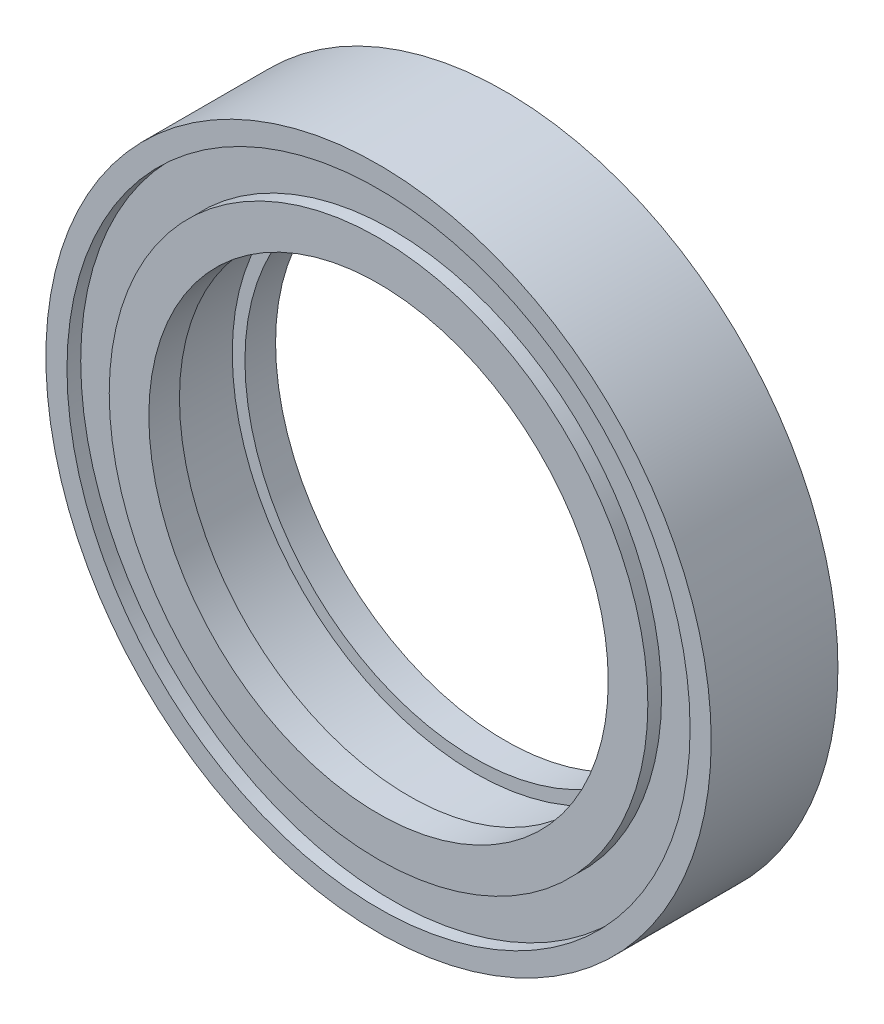
ISO-10303-21;
HEADER;
FILE_DESCRIPTION(('STEP AP214'),'2;1');
FILE_NAME('part.step','',(''),(''),'','','');
FILE_SCHEMA(('AUTOMOTIVE_DESIGN { 1 0 10303 214 1 1 1 1 }'));
ENDSEC;
DATA;
#1=APPLICATION_CONTEXT('core data for automotive mechanical design processes');
#2=APPLICATION_PROTOCOL_DEFINITION('international standard','automotive_design',2000,#1);
#3=PRODUCT_CONTEXT('',#1,'mechanical');
#4=PRODUCT('Part','Part','',(#3));
#5=PRODUCT_RELATED_PRODUCT_CATEGORY('part','',(#4));
#6=PRODUCT_DEFINITION_FORMATION('','',#4);
#7=PRODUCT_DEFINITION_CONTEXT('part definition',#1,'design');
#8=PRODUCT_DEFINITION('design','',#6,#7);
#9=PRODUCT_DEFINITION_SHAPE('','',#8);
#10=(LENGTH_UNIT() NAMED_UNIT(*) SI_UNIT(.MILLI.,.METRE.));
#11=(NAMED_UNIT(*) PLANE_ANGLE_UNIT() SI_UNIT($,.RADIAN.));
#12=(NAMED_UNIT(*) SI_UNIT($,.STERADIAN.) SOLID_ANGLE_UNIT());
#13=UNCERTAINTY_MEASURE_WITH_UNIT(LENGTH_MEASURE(1.E-05),#10,'distance_accuracy_value','');
#14=(GEOMETRIC_REPRESENTATION_CONTEXT(3) GLOBAL_UNCERTAINTY_ASSIGNED_CONTEXT((#13)) GLOBAL_UNIT_ASSIGNED_CONTEXT((#10,
#11,#12)) REPRESENTATION_CONTEXT('',''));
#15=CARTESIAN_POINT('',(0.,0.,0.));
#16=DIRECTION('',(0.,0.,1.));
#17=DIRECTION('',(1.,0.,0.));
#18=AXIS2_PLACEMENT_3D('',#15,#16,#17);
#19=CARTESIAN_POINT('',(3.43024899888577E-12,0.,1000.));
#20=DIRECTION('',(0.,0.,1.));
#21=DIRECTION('',(1.,0.,0.));
#22=AXIS2_PLACEMENT_3D('',#19,#20,#21);
#23=CYLINDRICAL_SURFACE('',#22,315.);
#24=CARTESIAN_POINT('',(2.05814939933142E-13,0.,59.9999999999989));
#25=DIRECTION('',(0.,0.,1.));
#26=DIRECTION('',(1.,0.,0.));
#27=AXIS2_PLACEMENT_3D('',#24,#25,#26);
#28=CIRCLE('',#27,315.);
#29=CARTESIAN_POINT('',(315.,0.,59.9999999999979));
#30=VERTEX_POINT('',#29);
#31=EDGE_CURVE('E104',#30,#30,#28,.T.);
#32=ORIENTED_EDGE('',*,*,#31,.F.);
#33=EDGE_LOOP('',(#32));
#34=FACE_BOUND('',#33,.T.);
#35=CARTESIAN_POINT('',(-2.0581493993315E-13,0.,-60.0000000000012));
#36=DIRECTION('',(0.,0.,1.));
#37=DIRECTION('',(1.,0.,0.));
#38=AXIS2_PLACEMENT_3D('',#35,#36,#37);
#39=CIRCLE('',#38,314.999999999999);
#40=CARTESIAN_POINT('',(314.999999999999,0.,-60.0000000000022));
#41=VERTEX_POINT('',#40);
#42=EDGE_CURVE('E10',#41,#41,#39,.T.);
#43=ORIENTED_EDGE('',*,*,#42,.T.);
#44=EDGE_LOOP('',(#43));
#45=FACE_BOUND('',#44,.T.);
#46=ADVANCED_FACE('F37',(#34,#45),#23,.T.);
#47=CARTESIAN_POINT('',(-315.,0.,-60.));
#48=DIRECTION('',(0.,0.,1.));
#49=DIRECTION('',(1.,0.,0.));
#50=AXIS2_PLACEMENT_3D('',#47,#48,#49);
#51=PLANE('',#50);
#52=ORIENTED_EDGE('',*,*,#42,.F.);
#53=EDGE_LOOP('',(#52));
#54=FACE_BOUND('',#53,.T.);
#55=CARTESIAN_POINT('',(-2.0581493993315E-13,0.,-60.0000000000012));
#56=DIRECTION('',(0.,0.,1.));
#57=DIRECTION('',(1.,0.,0.));
#58=AXIS2_PLACEMENT_3D('',#55,#56,#57);
#59=CIRCLE('',#58,294.999999999999);
#60=CARTESIAN_POINT('',(294.999999999999,0.,-60.0000000000022));
#61=VERTEX_POINT('',#60);
#62=EDGE_CURVE('E44',#61,#61,#59,.T.);
#63=ORIENTED_EDGE('',*,*,#62,.T.);
#64=EDGE_LOOP('',(#63));
#65=FACE_BOUND('',#64,.T.);
#66=ADVANCED_FACE('F112',(#54,#65),#51,.F.);
#67=CARTESIAN_POINT('',(3.43024899888577E-12,0.,1000.));
#68=DIRECTION('',(0.,0.,1.));
#69=DIRECTION('',(1.,0.,0.));
#70=AXIS2_PLACEMENT_3D('',#67,#68,#69);
#71=CYLINDRICAL_SURFACE('',#70,294.999999999999);
#72=ORIENTED_EDGE('',*,*,#62,.F.);
#73=EDGE_LOOP('',(#72));
#74=FACE_BOUND('',#73,.T.);
#75=CARTESIAN_POINT('',(-1.61221702947636E-13,0.,-47.0000000000015));
#76=DIRECTION('',(0.,0.,1.));
#77=DIRECTION('',(1.,0.,0.));
#78=AXIS2_PLACEMENT_3D('',#75,#76,#77);
#79=CIRCLE('',#78,294.999999999999);
#80=CARTESIAN_POINT('',(294.999999999999,0.,-47.0000000000025));
#81=VERTEX_POINT('',#80);
#82=EDGE_CURVE('E49',#81,#81,#79,.T.);
#83=ORIENTED_EDGE('',*,*,#82,.T.);
#84=EDGE_LOOP('',(#83));
#85=FACE_BOUND('',#84,.T.);
#86=ADVANCED_FACE('F116',(#74,#85),#71,.F.);
#87=CARTESIAN_POINT('',(-295.,0.,-47.0000000000002));
#88=DIRECTION('',(0.,0.,1.));
#89=DIRECTION('',(1.,0.,0.));
#90=AXIS2_PLACEMENT_3D('',#87,#88,#89);
#91=PLANE('',#90);
#92=ORIENTED_EDGE('',*,*,#82,.F.);
#93=EDGE_LOOP('',(#92));
#94=FACE_BOUND('',#93,.T.);
#95=CARTESIAN_POINT('',(-1.61221702947635E-13,0.,-47.0000000000013));
#96=DIRECTION('',(0.,0.,1.));
#97=DIRECTION('',(1.,0.,0.));
#98=AXIS2_PLACEMENT_3D('',#95,#96,#97);
#99=CIRCLE('',#98,255.);
#100=CARTESIAN_POINT('',(254.999999999999,0.,-47.0000000000021));
#101=VERTEX_POINT('',#100);
#102=EDGE_CURVE('E54',#101,#101,#99,.T.);
#103=ORIENTED_EDGE('',*,*,#102,.T.);
#104=EDGE_LOOP('',(#103));
#105=FACE_BOUND('',#104,.T.);
#106=ADVANCED_FACE('F121',(#94,#105),#91,.F.);
#107=CARTESIAN_POINT('',(3.43024899888577E-12,0.,1000.));
#108=DIRECTION('',(0.,0.,1.));
#109=DIRECTION('',(1.,0.,0.));
#110=AXIS2_PLACEMENT_3D('',#107,#108,#109);
#111=CYLINDRICAL_SURFACE('',#110,255.);
#112=ORIENTED_EDGE('',*,*,#102,.F.);
#113=EDGE_LOOP('',(#112));
#114=FACE_BOUND('',#113,.T.);
#115=CARTESIAN_POINT('',(-2.0581493993315E-13,0.,-60.0000000000009));
#116=DIRECTION('',(0.,0.,1.));
#117=DIRECTION('',(1.,0.,0.));
#118=AXIS2_PLACEMENT_3D('',#115,#116,#117);
#119=CIRCLE('',#118,255.);
#120=CARTESIAN_POINT('',(254.999999999999,0.,-60.0000000000018));
#121=VERTEX_POINT('',#120);
#122=EDGE_CURVE('E60',#121,#121,#119,.T.);
#123=ORIENTED_EDGE('',*,*,#122,.T.);
#124=EDGE_LOOP('',(#123));
#125=FACE_BOUND('',#124,.T.);
#126=ADVANCED_FACE('F127',(#114,#125),#111,.T.);
#127=CARTESIAN_POINT('',(-255.,0.,-59.9999999999999));
#128=DIRECTION('',(0.,0.,1.));
#129=DIRECTION('',(1.,0.,0.));
#130=AXIS2_PLACEMENT_3D('',#127,#128,#129);
#131=PLANE('',#130);
#132=ORIENTED_EDGE('',*,*,#122,.F.);
#133=EDGE_LOOP('',(#132));
#134=FACE_BOUND('',#133,.T.);
#135=CARTESIAN_POINT('',(-2.05814939933149E-13,0.,-60.0000000000007));
#136=DIRECTION('',(0.,0.,1.));
#137=DIRECTION('',(1.,0.,0.));
#138=AXIS2_PLACEMENT_3D('',#135,#136,#137);
#139=CIRCLE('',#138,217.499999999999);
#140=CARTESIAN_POINT('',(217.499999999999,0.,-60.0000000000015));
#141=VERTEX_POINT('',#140);
#142=EDGE_CURVE('E64',#141,#141,#139,.T.);
#143=ORIENTED_EDGE('',*,*,#142,.T.);
#144=EDGE_LOOP('',(#143));
#145=FACE_BOUND('',#144,.T.);
#146=ADVANCED_FACE('F131',(#134,#145),#131,.F.);
#147=CARTESIAN_POINT('',(3.43024899888577E-12,0.,1000.));
#148=DIRECTION('',(0.,0.,1.));
#149=DIRECTION('',(1.,0.,0.));
#150=AXIS2_PLACEMENT_3D('',#147,#148,#149);
#151=CYLINDRICAL_SURFACE('',#150,217.5);
#152=ORIENTED_EDGE('',*,*,#142,.F.);
#153=EDGE_LOOP('',(#152));
#154=FACE_BOUND('',#153,.T.);
#155=CARTESIAN_POINT('',(-1.06337718965461E-13,0.,-31.0000000000006));
#156=DIRECTION('',(0.,0.,1.));
#157=DIRECTION('',(1.,0.,0.));
#158=AXIS2_PLACEMENT_3D('',#155,#156,#157);
#159=CIRCLE('',#158,217.5);
#160=CARTESIAN_POINT('',(217.499999999999,0.,-31.0000000000013));
#161=VERTEX_POINT('',#160);
#162=EDGE_CURVE('E68',#161,#161,#159,.T.);
#163=ORIENTED_EDGE('',*,*,#162,.T.);
#164=EDGE_LOOP('',(#163));
#165=FACE_BOUND('',#164,.T.);
#166=ADVANCED_FACE('F135',(#154,#165),#151,.F.);
#167=CARTESIAN_POINT('',(-217.5,0.,-31.));
#168=DIRECTION('',(0.,0.,-1.));
#169=DIRECTION('',(-1.,0.,0.));
#170=AXIS2_PLACEMENT_3D('',#167,#168,#169);
#171=PLANE('',#170);
#172=ORIENTED_EDGE('',*,*,#162,.F.);
#173=EDGE_LOOP('',(#172));
#174=FACE_BOUND('',#173,.T.);
#175=CARTESIAN_POINT('',(-1.06337718965461E-13,0.,-31.0000000000008));
#176=DIRECTION('',(0.,0.,1.));
#177=DIRECTION('',(1.,0.,0.));
#178=AXIS2_PLACEMENT_3D('',#175,#176,#177);
#179=CIRCLE('',#178,229.5);
#180=CARTESIAN_POINT('',(229.499999999999,0.,-31.0000000000016));
#181=VERTEX_POINT('',#180);
#182=EDGE_CURVE('E72',#181,#181,#179,.T.);
#183=ORIENTED_EDGE('',*,*,#182,.T.);
#184=EDGE_LOOP('',(#183));
#185=FACE_BOUND('',#184,.T.);
#186=ADVANCED_FACE('F139',(#174,#185),#171,.F.);
#187=CARTESIAN_POINT('',(3.43024899888577E-12,0.,1000.));
#188=DIRECTION('',(0.,0.,1.));
#189=DIRECTION('',(1.,0.,0.));
#190=AXIS2_PLACEMENT_3D('',#187,#188,#189);
#191=CYLINDRICAL_SURFACE('',#190,229.5);
#192=ORIENTED_EDGE('',*,*,#182,.F.);
#193=EDGE_LOOP('',(#192));
#194=FACE_BOUND('',#193,.T.);
#195=CARTESIAN_POINT('',(1.06337718965456E-13,0.,30.9999999999993));
#196=DIRECTION('',(0.,0.,1.));
#197=DIRECTION('',(1.,0.,0.));
#198=AXIS2_PLACEMENT_3D('',#195,#196,#197);
#199=CIRCLE('',#198,229.5);
#200=CARTESIAN_POINT('',(229.5,0.,30.9999999999985));
#201=VERTEX_POINT('',#200);
#202=EDGE_CURVE('E76',#201,#201,#199,.T.);
#203=ORIENTED_EDGE('',*,*,#202,.T.);
#204=EDGE_LOOP('',(#203));
#205=FACE_BOUND('',#204,.T.);
#206=ADVANCED_FACE('F143',(#194,#205),#191,.F.);
#207=CARTESIAN_POINT('',(-229.5,0.,31.));
#208=DIRECTION('',(0.,0.,1.));
#209=DIRECTION('',(1.,0.,0.));
#210=AXIS2_PLACEMENT_3D('',#207,#208,#209);
#211=PLANE('',#210);
#212=ORIENTED_EDGE('',*,*,#202,.F.);
#213=EDGE_LOOP('',(#212));
#214=FACE_BOUND('',#213,.T.);
#215=CARTESIAN_POINT('',(1.06337718965456E-13,0.,30.9999999999993));
#216=DIRECTION('',(0.,0.,1.));
#217=DIRECTION('',(1.,0.,0.));
#218=AXIS2_PLACEMENT_3D('',#215,#216,#217);
#219=CIRCLE('',#218,217.5);
#220=CARTESIAN_POINT('',(217.5,0.,30.9999999999985));
#221=VERTEX_POINT('',#220);
#222=EDGE_CURVE('E80',#221,#221,#219,.T.);
#223=ORIENTED_EDGE('',*,*,#222,.T.);
#224=EDGE_LOOP('',(#223));
#225=FACE_BOUND('',#224,.T.);
#226=ADVANCED_FACE('F147',(#214,#225),#211,.F.);
#227=CARTESIAN_POINT('',(3.43024899888577E-12,0.,1000.));
#228=DIRECTION('',(0.,0.,1.));
#229=DIRECTION('',(1.,0.,0.));
#230=AXIS2_PLACEMENT_3D('',#227,#228,#229);
#231=CYLINDRICAL_SURFACE('',#230,217.5);
#232=ORIENTED_EDGE('',*,*,#222,.F.);
#233=EDGE_LOOP('',(#232));
#234=FACE_BOUND('',#233,.T.);
#235=CARTESIAN_POINT('',(2.05814939933143E-13,0.,59.9999999999992));
#236=DIRECTION('',(0.,0.,1.));
#237=DIRECTION('',(1.,0.,0.));
#238=AXIS2_PLACEMENT_3D('',#235,#236,#237);
#239=CIRCLE('',#238,217.5);
#240=CARTESIAN_POINT('',(217.5,0.,59.9999999999984));
#241=VERTEX_POINT('',#240);
#242=EDGE_CURVE('E84',#241,#241,#239,.T.);
#243=ORIENTED_EDGE('',*,*,#242,.T.);
#244=EDGE_LOOP('',(#243));
#245=FACE_BOUND('',#244,.T.);
#246=ADVANCED_FACE('F151',(#234,#245),#231,.F.);
#247=CARTESIAN_POINT('',(-217.5,0.,59.9999999999999));
#248=DIRECTION('',(0.,0.,-1.));
#249=DIRECTION('',(-1.,0.,0.));
#250=AXIS2_PLACEMENT_3D('',#247,#248,#249);
#251=PLANE('',#250);
#252=ORIENTED_EDGE('',*,*,#242,.F.);
#253=EDGE_LOOP('',(#252));
#254=FACE_BOUND('',#253,.T.);
#255=CARTESIAN_POINT('',(2.05814939933143E-13,0.,59.9999999999992));
#256=DIRECTION('',(0.,0.,1.));
#257=DIRECTION('',(1.,0.,0.));
#258=AXIS2_PLACEMENT_3D('',#255,#256,#257);
#259=CIRCLE('',#258,255.);
#260=CARTESIAN_POINT('',(255.,0.,59.9999999999983));
#261=VERTEX_POINT('',#260);
#262=EDGE_CURVE('E88',#261,#261,#259,.T.);
#263=ORIENTED_EDGE('',*,*,#262,.T.);
#264=EDGE_LOOP('',(#263));
#265=FACE_BOUND('',#264,.T.);
#266=ADVANCED_FACE('F155',(#254,#265),#251,.F.);
#267=CARTESIAN_POINT('',(3.43024899888577E-12,0.,1000.));
#268=DIRECTION('',(0.,0.,1.));
#269=DIRECTION('',(1.,0.,0.));
#270=AXIS2_PLACEMENT_3D('',#267,#268,#269);
#271=CYLINDRICAL_SURFACE('',#270,255.);
#272=ORIENTED_EDGE('',*,*,#262,.F.);
#273=EDGE_LOOP('',(#272));
#274=FACE_BOUND('',#273,.T.);
#275=CARTESIAN_POINT('',(1.61221702947628E-13,0.,46.9999999999992));
#276=DIRECTION('',(0.,0.,1.));
#277=DIRECTION('',(1.,0.,0.));
#278=AXIS2_PLACEMENT_3D('',#275,#276,#277);
#279=CIRCLE('',#278,255.);
#280=CARTESIAN_POINT('',(255.,0.,46.9999999999983));
#281=VERTEX_POINT('',#280);
#282=EDGE_CURVE('E92',#281,#281,#279,.T.);
#283=ORIENTED_EDGE('',*,*,#282,.T.);
#284=EDGE_LOOP('',(#283));
#285=FACE_BOUND('',#284,.T.);
#286=ADVANCED_FACE('F159',(#274,#285),#271,.T.);
#287=CARTESIAN_POINT('',(-255.,0.,46.9999999999999));
#288=DIRECTION('',(0.,0.,-1.));
#289=DIRECTION('',(-1.,0.,0.));
#290=AXIS2_PLACEMENT_3D('',#287,#288,#289);
#291=PLANE('',#290);
#292=ORIENTED_EDGE('',*,*,#282,.F.);
#293=EDGE_LOOP('',(#292));
#294=FACE_BOUND('',#293,.T.);
#295=CARTESIAN_POINT('',(1.61221702947628E-13,0.,46.999999999999));
#296=DIRECTION('',(0.,0.,1.));
#297=DIRECTION('',(1.,0.,0.));
#298=AXIS2_PLACEMENT_3D('',#295,#296,#297);
#299=CIRCLE('',#298,295.);
#300=CARTESIAN_POINT('',(295.,0.,46.999999999998));
#301=VERTEX_POINT('',#300);
#302=EDGE_CURVE('E96',#301,#301,#299,.T.);
#303=ORIENTED_EDGE('',*,*,#302,.T.);
#304=EDGE_LOOP('',(#303));
#305=FACE_BOUND('',#304,.T.);
#306=ADVANCED_FACE('F163',(#294,#305),#291,.F.);
#307=CARTESIAN_POINT('',(3.43024899888577E-12,0.,1000.));
#308=DIRECTION('',(0.,0.,1.));
#309=DIRECTION('',(1.,0.,0.));
#310=AXIS2_PLACEMENT_3D('',#307,#308,#309);
#311=CYLINDRICAL_SURFACE('',#310,295.);
#312=ORIENTED_EDGE('',*,*,#302,.F.);
#313=EDGE_LOOP('',(#312));
#314=FACE_BOUND('',#313,.T.);
#315=CARTESIAN_POINT('',(2.05814939933143E-13,0.,59.9999999999991));
#316=DIRECTION('',(0.,0.,1.));
#317=DIRECTION('',(1.,0.,0.));
#318=AXIS2_PLACEMENT_3D('',#315,#316,#317);
#319=CIRCLE('',#318,295.);
#320=CARTESIAN_POINT('',(295.,0.,59.999999999998));
#321=VERTEX_POINT('',#320);
#322=EDGE_CURVE('E100',#321,#321,#319,.T.);
#323=ORIENTED_EDGE('',*,*,#322,.T.);
#324=EDGE_LOOP('',(#323));
#325=FACE_BOUND('',#324,.T.);
#326=ADVANCED_FACE('F167',(#314,#325),#311,.F.);
#327=CARTESIAN_POINT('',(-294.999999999999,0.,60.));
#328=DIRECTION('',(0.,0.,-1.));
#329=DIRECTION('',(-1.,0.,0.));
#330=AXIS2_PLACEMENT_3D('',#327,#328,#329);
#331=PLANE('',#330);
#332=ORIENTED_EDGE('',*,*,#322,.F.);
#333=EDGE_LOOP('',(#332));
#334=FACE_BOUND('',#333,.T.);
#335=ORIENTED_EDGE('',*,*,#31,.T.);
#336=EDGE_LOOP('',(#335));
#337=FACE_BOUND('',#336,.T.);
#338=ADVANCED_FACE('F109',(#334,#337),#331,.F.);
#339=CLOSED_SHELL('',(#46,#66,#86,#106,#126,#146,#166,#186,#206,#226,#246,#266,#286,#306,#326,#338));
#340=MANIFOLD_SOLID_BREP('B2',#339);
#341=ADVANCED_BREP_SHAPE_REPRESENTATION('',(#18,#340),#14);
#342=SHAPE_DEFINITION_REPRESENTATION(#9,#341);
ENDSEC;
END-ISO-10303-21;
